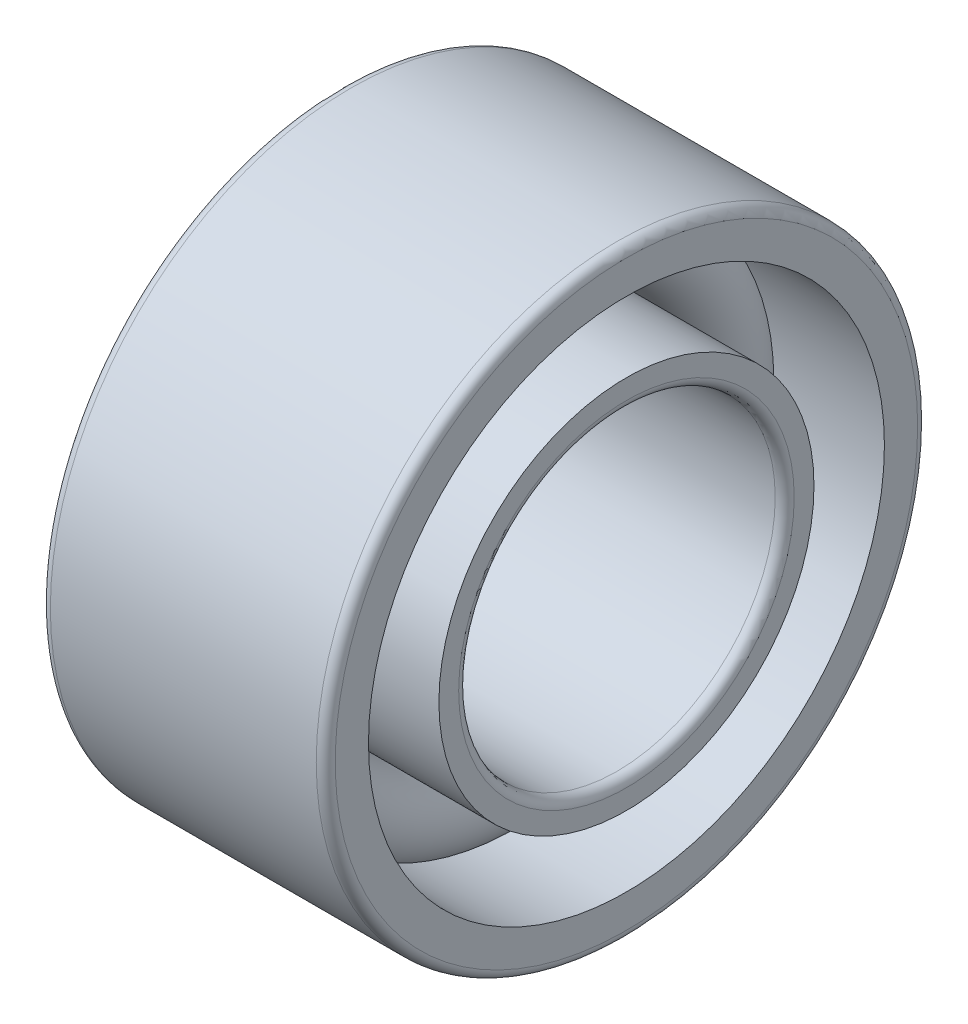
ISO-10303-21;
HEADER;
FILE_DESCRIPTION(('STEP AP214'),'2;1');
FILE_NAME('part.step','',(''),(''),'','','');
FILE_SCHEMA(('AUTOMOTIVE_DESIGN { 1 0 10303 214 1 1 1 1 }'));
ENDSEC;
DATA;
#1=APPLICATION_CONTEXT('core data for automotive mechanical design processes');
#2=APPLICATION_PROTOCOL_DEFINITION('international standard','automotive_design',2000,#1);
#3=PRODUCT_CONTEXT('',#1,'mechanical');
#4=PRODUCT('Part','Part','',(#3));
#5=PRODUCT_RELATED_PRODUCT_CATEGORY('part','',(#4));
#6=PRODUCT_DEFINITION_FORMATION('','',#4);
#7=PRODUCT_DEFINITION_CONTEXT('part definition',#1,'design');
#8=PRODUCT_DEFINITION('design','',#6,#7);
#9=PRODUCT_DEFINITION_SHAPE('','',#8);
#10=(LENGTH_UNIT() NAMED_UNIT(*) SI_UNIT(.MILLI.,.METRE.));
#11=(NAMED_UNIT(*) PLANE_ANGLE_UNIT() SI_UNIT($,.RADIAN.));
#12=(NAMED_UNIT(*) SI_UNIT($,.STERADIAN.) SOLID_ANGLE_UNIT());
#13=UNCERTAINTY_MEASURE_WITH_UNIT(LENGTH_MEASURE(1.E-05),#10,'distance_accuracy_value','');
#14=(GEOMETRIC_REPRESENTATION_CONTEXT(3) GLOBAL_UNCERTAINTY_ASSIGNED_CONTEXT((#13)) GLOBAL_UNIT_ASSIGNED_CONTEXT((#10,
#11,#12)) REPRESENTATION_CONTEXT('',''));
#15=CARTESIAN_POINT('',(0.,0.,0.));
#16=DIRECTION('',(0.,0.,1.));
#17=DIRECTION('',(1.,0.,0.));
#18=AXIS2_PLACEMENT_3D('',#15,#16,#17);
#19=CARTESIAN_POINT('',(0.,0.,0.));
#20=DIRECTION('',(-1.,0.,0.));
#21=DIRECTION('',(0.,0.,1.));
#22=AXIS2_PLACEMENT_3D('',#19,#20,#21);
#23=TOROIDAL_SURFACE('',#22,7.25,1.35);
#24=CARTESIAN_POINT('',(1.0062305898749,0.,0.));
#25=DIRECTION('',(-1.,0.,0.));
#26=DIRECTION('',(0.,0.,1.));
#27=AXIS2_PLACEMENT_3D('',#24,#25,#26);
#28=CIRCLE('',#27,8.15);
#29=CARTESIAN_POINT('',(1.0062305898749,0.,8.15));
#30=VERTEX_POINT('',#29);
#31=EDGE_CURVE('E43',#30,#30,#28,.F.);
#32=ORIENTED_EDGE('',*,*,#31,.T.);
#33=EDGE_LOOP('',(#32));
#34=FACE_BOUND('',#33,.T.);
#35=CARTESIAN_POINT('',(0.258602010819712,0.,0.));
#36=DIRECTION('',(-1.,0.,0.));
#37=DIRECTION('',(0.,0.,1.));
#38=AXIS2_PLACEMENT_3D('',#35,#36,#37);
#39=CIRCLE('',#38,5.925);
#40=CARTESIAN_POINT('',(0.258602010819712,0.,5.925));
#41=VERTEX_POINT('',#40);
#42=EDGE_CURVE('E10',#41,#41,#39,.T.);
#43=ORIENTED_EDGE('',*,*,#42,.T.);
#44=EDGE_LOOP('',(#43));
#45=FACE_BOUND('',#44,.T.);
#46=ADVANCED_FACE('F39',(#34,#45),#23,.T.);
#47=CARTESIAN_POINT('',(-20.6375,0.,0.));
#48=DIRECTION('',(1.,0.,0.));
#49=DIRECTION('',(0.,0.,-1.));
#50=AXIS2_PLACEMENT_3D('',#47,#48,#49);
#51=CYLINDRICAL_SURFACE('',#50,5.925);
#52=CARTESIAN_POINT('',(4.5,0.,0.));
#53=DIRECTION('',(1.,0.,0.));
#54=DIRECTION('',(0.,0.,-1.));
#55=AXIS2_PLACEMENT_3D('',#52,#53,#54);
#56=CIRCLE('',#55,5.925);
#57=CARTESIAN_POINT('',(4.5,0.,-5.925));
#58=VERTEX_POINT('',#57);
#59=EDGE_CURVE('E55',#58,#58,#56,.T.);
#60=ORIENTED_EDGE('',*,*,#59,.F.);
#61=EDGE_LOOP('',(#60));
#62=FACE_BOUND('',#61,.T.);
#63=ORIENTED_EDGE('',*,*,#42,.F.);
#64=EDGE_LOOP('',(#63));
#65=FACE_BOUND('',#64,.T.);
#66=ADVANCED_FACE('F107',(#62,#65),#51,.T.);
#67=CARTESIAN_POINT('',(-20.6375,0.,0.));
#68=DIRECTION('',(1.,0.,0.));
#69=DIRECTION('',(0.,0.,-1.));
#70=AXIS2_PLACEMENT_3D('',#67,#68,#69);
#71=CYLINDRICAL_SURFACE('',#70,6.35);
#72=CARTESIAN_POINT('',(-4.5,0.,0.));
#73=DIRECTION('',(1.,0.,0.));
#74=DIRECTION('',(0.,0.,-1.));
#75=AXIS2_PLACEMENT_3D('',#72,#73,#74);
#76=CIRCLE('',#75,6.35);
#77=CARTESIAN_POINT('',(-4.5,0.,-6.35));
#78=VERTEX_POINT('',#77);
#79=EDGE_CURVE('E68',#78,#78,#76,.T.);
#80=ORIENTED_EDGE('',*,*,#79,.T.);
#81=EDGE_LOOP('',(#80));
#82=FACE_BOUND('',#81,.T.);
#83=CARTESIAN_POINT('',(-1.0062305898749,0.,0.));
#84=DIRECTION('',(1.,0.,0.));
#85=DIRECTION('',(0.,0.,-1.));
#86=AXIS2_PLACEMENT_3D('',#83,#84,#85);
#87=CIRCLE('',#86,6.35);
#88=CARTESIAN_POINT('',(-1.0062305898749,0.,-6.35));
#89=VERTEX_POINT('',#88);
#90=EDGE_CURVE('E48',#89,#89,#87,.T.);
#91=ORIENTED_EDGE('',*,*,#90,.F.);
#92=EDGE_LOOP('',(#91));
#93=FACE_BOUND('',#92,.T.);
#94=ADVANCED_FACE('F110',(#82,#93),#71,.T.);
#95=CARTESIAN_POINT('',(4.5,5.3,0.));
#96=DIRECTION('',(1.,0.,0.));
#97=DIRECTION('',(0.,0.,-1.));
#98=AXIS2_PLACEMENT_3D('',#95,#96,#97);
#99=PLANE('',#98);
#100=ORIENTED_EDGE('',*,*,#59,.T.);
#101=EDGE_LOOP('',(#100));
#102=FACE_BOUND('',#101,.T.);
#103=CARTESIAN_POINT('',(4.5,0.,0.));
#104=DIRECTION('',(1.,0.,0.));
#105=DIRECTION('',(0.,0.,-1.));
#106=AXIS2_PLACEMENT_3D('',#103,#104,#105);
#107=CIRCLE('',#106,5.3);
#108=CARTESIAN_POINT('',(4.5,0.,-5.3));
#109=VERTEX_POINT('',#108);
#110=EDGE_CURVE('E96',#109,#109,#107,.T.);
#111=ORIENTED_EDGE('',*,*,#110,.F.);
#112=EDGE_LOOP('',(#111));
#113=FACE_BOUND('',#112,.T.);
#114=ADVANCED_FACE('F104',(#102,#113),#99,.T.);
#115=CARTESIAN_POINT('',(4.2,0.,0.));
#116=DIRECTION('',(1.,0.,0.));
#117=DIRECTION('',(0.,0.,-1.));
#118=AXIS2_PLACEMENT_3D('',#115,#116,#117);
#119=TOROIDAL_SURFACE('',#118,5.3,0.300000000000001);
#120=ORIENTED_EDGE('',*,*,#110,.T.);
#121=EDGE_LOOP('',(#120));
#122=FACE_BOUND('',#121,.T.);
#123=CARTESIAN_POINT('',(4.2,0.,0.));
#124=DIRECTION('',(1.,0.,0.));
#125=DIRECTION('',(0.,0.,-1.));
#126=AXIS2_PLACEMENT_3D('',#123,#124,#125);
#127=CIRCLE('',#126,5.);
#128=CARTESIAN_POINT('',(4.2,0.,-5.));
#129=VERTEX_POINT('',#128);
#130=EDGE_CURVE('E92',#129,#129,#127,.T.);
#131=ORIENTED_EDGE('',*,*,#130,.F.);
#132=EDGE_LOOP('',(#131));
#133=FACE_BOUND('',#132,.T.);
#134=ADVANCED_FACE('F121',(#122,#133),#119,.T.);
#135=CARTESIAN_POINT('',(-20.6375,0.,0.));
#136=DIRECTION('',(1.,0.,0.));
#137=DIRECTION('',(0.,0.,-1.));
#138=AXIS2_PLACEMENT_3D('',#135,#136,#137);
#139=CYLINDRICAL_SURFACE('',#138,5.);
#140=ORIENTED_EDGE('',*,*,#130,.T.);
#141=EDGE_LOOP('',(#140));
#142=FACE_BOUND('',#141,.T.);
#143=CARTESIAN_POINT('',(-4.2,0.,0.));
#144=DIRECTION('',(1.,0.,0.));
#145=DIRECTION('',(0.,0.,-1.));
#146=AXIS2_PLACEMENT_3D('',#143,#144,#145);
#147=CIRCLE('',#146,5.);
#148=CARTESIAN_POINT('',(-4.2,0.,-5.));
#149=VERTEX_POINT('',#148);
#150=EDGE_CURVE('E88',#149,#149,#147,.T.);
#151=ORIENTED_EDGE('',*,*,#150,.F.);
#152=EDGE_LOOP('',(#151));
#153=FACE_BOUND('',#152,.T.);
#154=ADVANCED_FACE('F124',(#142,#153),#139,.F.);
#155=CARTESIAN_POINT('',(-4.2,0.,0.));
#156=DIRECTION('',(1.,0.,0.));
#157=DIRECTION('',(0.,0.,-1.));
#158=AXIS2_PLACEMENT_3D('',#155,#156,#157);
#159=TOROIDAL_SURFACE('',#158,5.3,0.300000000000001);
#160=ORIENTED_EDGE('',*,*,#150,.T.);
#161=EDGE_LOOP('',(#160));
#162=FACE_BOUND('',#161,.T.);
#163=CARTESIAN_POINT('',(-4.5,0.,0.));
#164=DIRECTION('',(1.,0.,0.));
#165=DIRECTION('',(0.,0.,-1.));
#166=AXIS2_PLACEMENT_3D('',#163,#164,#165);
#167=CIRCLE('',#166,5.3);
#168=CARTESIAN_POINT('',(-4.5,0.,-5.3));
#169=VERTEX_POINT('',#168);
#170=EDGE_CURVE('E84',#169,#169,#167,.T.);
#171=ORIENTED_EDGE('',*,*,#170,.F.);
#172=EDGE_LOOP('',(#171));
#173=FACE_BOUND('',#172,.T.);
#174=ADVANCED_FACE('F128',(#162,#173),#159,.T.);
#175=CARTESIAN_POINT('',(-4.5,6.35,0.));
#176=DIRECTION('',(-1.,0.,0.));
#177=DIRECTION('',(0.,0.,1.));
#178=AXIS2_PLACEMENT_3D('',#175,#176,#177);
#179=PLANE('',#178);
#180=ORIENTED_EDGE('',*,*,#170,.T.);
#181=EDGE_LOOP('',(#180));
#182=FACE_BOUND('',#181,.T.);
#183=ORIENTED_EDGE('',*,*,#79,.F.);
#184=EDGE_LOOP('',(#183));
#185=FACE_BOUND('',#184,.T.);
#186=ADVANCED_FACE('F132',(#182,#185),#179,.T.);
#187=CARTESIAN_POINT('',(-0.258602010819721,0.,0.));
#188=DIRECTION('',(1.,0.,0.));
#189=DIRECTION('',(0.,0.,-1.));
#190=AXIS2_PLACEMENT_3D('',#187,#188,#189);
#191=CIRCLE('',#190,8.575);
#192=CARTESIAN_POINT('',(-0.258602010819721,0.,-8.575));
#193=VERTEX_POINT('',#192);
#194=EDGE_CURVE('E58',#193,#193,#191,.F.);
#195=ORIENTED_EDGE('',*,*,#194,.T.);
#196=EDGE_LOOP('',(#195));
#197=FACE_BOUND('',#196,.T.);
#198=ORIENTED_EDGE('',*,*,#90,.T.);
#199=EDGE_LOOP('',(#198));
#200=FACE_BOUND('',#199,.T.);
#201=ADVANCED_FACE('F41',(#197,#200),#23,.T.);
#202=CARTESIAN_POINT('',(-20.6375,0.,0.));
#203=DIRECTION('',(1.,0.,0.));
#204=DIRECTION('',(0.,0.,-1.));
#205=AXIS2_PLACEMENT_3D('',#202,#203,#204);
#206=CYLINDRICAL_SURFACE('',#205,8.15);
#207=CARTESIAN_POINT('',(4.5,0.,0.));
#208=DIRECTION('',(1.,0.,0.));
#209=DIRECTION('',(0.,0.,-1.));
#210=AXIS2_PLACEMENT_3D('',#207,#208,#209);
#211=CIRCLE('',#210,8.15);
#212=CARTESIAN_POINT('',(4.5,0.,-8.15));
#213=VERTEX_POINT('',#212);
#214=EDGE_CURVE('E176',#213,#213,#211,.T.);
#215=ORIENTED_EDGE('',*,*,#214,.T.);
#216=EDGE_LOOP('',(#215));
#217=FACE_BOUND('',#216,.T.);
#218=ORIENTED_EDGE('',*,*,#31,.F.);
#219=EDGE_LOOP('',(#218));
#220=FACE_BOUND('',#219,.T.);
#221=ADVANCED_FACE('F154',(#217,#220),#206,.F.);
#222=CARTESIAN_POINT('',(-20.6375,0.,0.));
#223=DIRECTION('',(1.,0.,0.));
#224=DIRECTION('',(0.,0.,-1.));
#225=AXIS2_PLACEMENT_3D('',#222,#223,#224);
#226=CYLINDRICAL_SURFACE('',#225,8.575);
#227=CARTESIAN_POINT('',(-4.5,0.,0.));
#228=DIRECTION('',(1.,0.,0.));
#229=DIRECTION('',(0.,0.,-1.));
#230=AXIS2_PLACEMENT_3D('',#227,#228,#229);
#231=CIRCLE('',#230,8.575);
#232=CARTESIAN_POINT('',(-4.5,0.,-8.575));
#233=VERTEX_POINT('',#232);
#234=EDGE_CURVE('E168',#233,#233,#231,.T.);
#235=ORIENTED_EDGE('',*,*,#234,.F.);
#236=EDGE_LOOP('',(#235));
#237=FACE_BOUND('',#236,.T.);
#238=ORIENTED_EDGE('',*,*,#194,.F.);
#239=EDGE_LOOP('',(#238));
#240=FACE_BOUND('',#239,.T.);
#241=ADVANCED_FACE('F141',(#237,#240),#226,.F.);
#242=CARTESIAN_POINT('',(-4.2,0.,0.));
#243=DIRECTION('',(1.,0.,0.));
#244=DIRECTION('',(0.,0.,-1.));
#245=AXIS2_PLACEMENT_3D('',#242,#243,#244);
#246=TOROIDAL_SURFACE('',#245,9.2,0.299999999999998);
#247=CARTESIAN_POINT('',(-4.5,0.,0.));
#248=DIRECTION('',(1.,0.,0.));
#249=DIRECTION('',(0.,0.,-1.));
#250=AXIS2_PLACEMENT_3D('',#247,#248,#249);
#251=CIRCLE('',#250,9.2);
#252=CARTESIAN_POINT('',(-4.5,0.,-9.2));
#253=VERTEX_POINT('',#252);
#254=EDGE_CURVE('E171',#253,#253,#251,.T.);
#255=ORIENTED_EDGE('',*,*,#254,.T.);
#256=EDGE_LOOP('',(#255));
#257=FACE_BOUND('',#256,.T.);
#258=CARTESIAN_POINT('',(-4.2,0.,0.));
#259=DIRECTION('',(1.,0.,0.));
#260=DIRECTION('',(0.,0.,-1.));
#261=AXIS2_PLACEMENT_3D('',#258,#259,#260);
#262=CIRCLE('',#261,9.49999999999999);
#263=CARTESIAN_POINT('',(-4.2,0.,-9.49999999999999));
#264=VERTEX_POINT('',#263);
#265=EDGE_CURVE('E61',#264,#264,#262,.T.);
#266=ORIENTED_EDGE('',*,*,#265,.F.);
#267=EDGE_LOOP('',(#266));
#268=FACE_BOUND('',#267,.T.);
#269=ADVANCED_FACE('F137',(#257,#268),#246,.T.);
#270=CARTESIAN_POINT('',(-20.6375,0.,0.));
#271=DIRECTION('',(1.,0.,0.));
#272=DIRECTION('',(0.,0.,-1.));
#273=AXIS2_PLACEMENT_3D('',#270,#271,#272);
#274=CYLINDRICAL_SURFACE('',#273,9.5);
#275=ORIENTED_EDGE('',*,*,#265,.T.);
#276=EDGE_LOOP('',(#275));
#277=FACE_BOUND('',#276,.T.);
#278=CARTESIAN_POINT('',(4.2,0.,0.));
#279=DIRECTION('',(1.,0.,0.));
#280=DIRECTION('',(0.,0.,-1.));
#281=AXIS2_PLACEMENT_3D('',#278,#279,#280);
#282=CIRCLE('',#281,9.5);
#283=CARTESIAN_POINT('',(4.2,0.,-9.5));
#284=VERTEX_POINT('',#283);
#285=EDGE_CURVE('E70',#284,#284,#282,.T.);
#286=ORIENTED_EDGE('',*,*,#285,.F.);
#287=EDGE_LOOP('',(#286));
#288=FACE_BOUND('',#287,.T.);
#289=ADVANCED_FACE('F140',(#277,#288),#274,.T.);
#290=CARTESIAN_POINT('',(4.2,0.,0.));
#291=DIRECTION('',(1.,0.,0.));
#292=DIRECTION('',(0.,0.,-1.));
#293=AXIS2_PLACEMENT_3D('',#290,#291,#292);
#294=TOROIDAL_SURFACE('',#293,9.2,0.299999999999998);
#295=ORIENTED_EDGE('',*,*,#285,.T.);
#296=EDGE_LOOP('',(#295));
#297=FACE_BOUND('',#296,.T.);
#298=CARTESIAN_POINT('',(4.5,0.,0.));
#299=DIRECTION('',(1.,0.,0.));
#300=DIRECTION('',(0.,0.,-1.));
#301=AXIS2_PLACEMENT_3D('',#298,#299,#300);
#302=CIRCLE('',#301,9.2);
#303=CARTESIAN_POINT('',(4.5,0.,-9.2));
#304=VERTEX_POINT('',#303);
#305=EDGE_CURVE('E77',#304,#304,#302,.T.);
#306=ORIENTED_EDGE('',*,*,#305,.F.);
#307=EDGE_LOOP('',(#306));
#308=FACE_BOUND('',#307,.T.);
#309=ADVANCED_FACE('F145',(#297,#308),#294,.T.);
#310=CARTESIAN_POINT('',(4.5,9.2,0.));
#311=DIRECTION('',(1.,0.,0.));
#312=DIRECTION('',(0.,0.,-1.));
#313=AXIS2_PLACEMENT_3D('',#310,#311,#312);
#314=PLANE('',#313);
#315=ORIENTED_EDGE('',*,*,#305,.T.);
#316=EDGE_LOOP('',(#315));
#317=FACE_BOUND('',#316,.T.);
#318=ORIENTED_EDGE('',*,*,#214,.F.);
#319=EDGE_LOOP('',(#318));
#320=FACE_BOUND('',#319,.T.);
#321=ADVANCED_FACE('F148',(#317,#320),#314,.T.);
#322=CARTESIAN_POINT('',(-4.5,8.575,0.));
#323=DIRECTION('',(-1.,0.,0.));
#324=DIRECTION('',(0.,0.,1.));
#325=AXIS2_PLACEMENT_3D('',#322,#323,#324);
#326=PLANE('',#325);
#327=ORIENTED_EDGE('',*,*,#234,.T.);
#328=EDGE_LOOP('',(#327));
#329=FACE_BOUND('',#328,.T.);
#330=ORIENTED_EDGE('',*,*,#254,.F.);
#331=EDGE_LOOP('',(#330));
#332=FACE_BOUND('',#331,.T.);
#333=ADVANCED_FACE('F152',(#329,#332),#326,.T.);
#334=CLOSED_SHELL('',(#46,#66,#94,#114,#134,#154,#174,#186,#201,#221,#241,#269,#289,#309,#321,#333));
#335=MANIFOLD_SOLID_BREP('B2',#334);
#336=ADVANCED_BREP_SHAPE_REPRESENTATION('',(#18,#335),#14);
#337=SHAPE_DEFINITION_REPRESENTATION(#9,#336);
ENDSEC;
END-ISO-10303-21;
